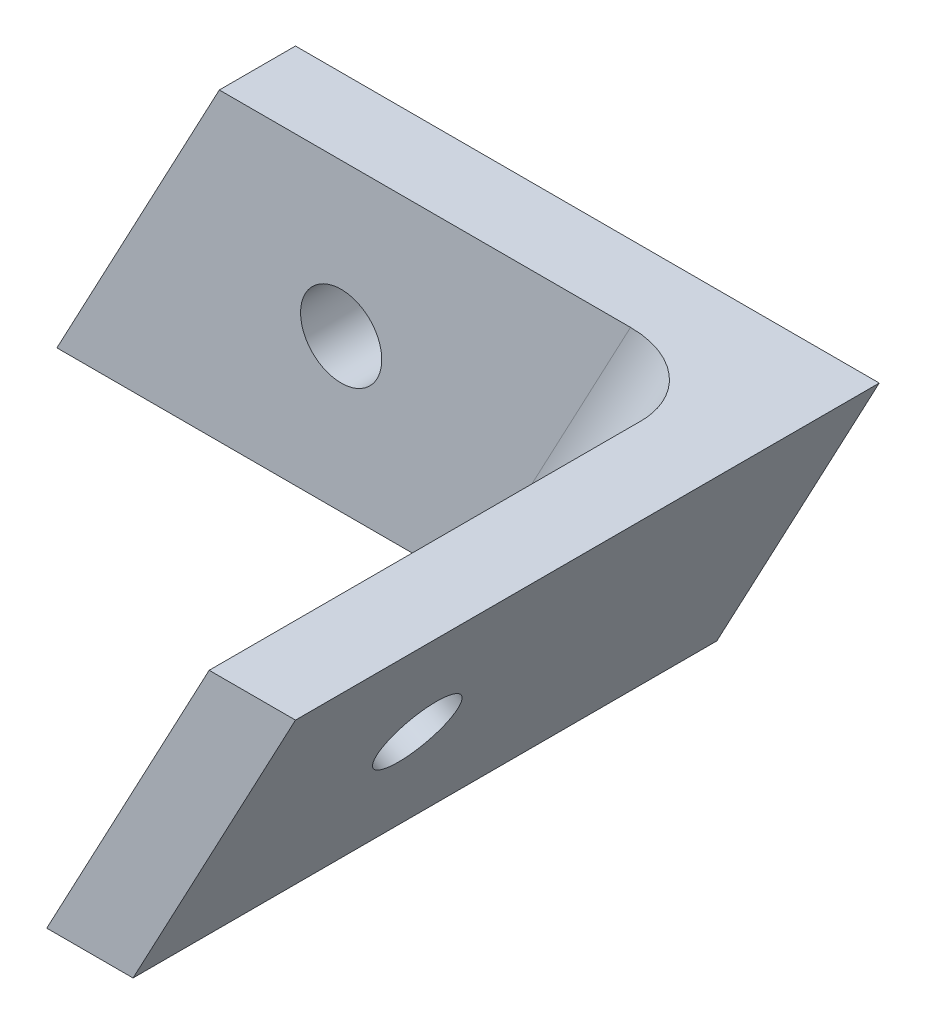
ISO-10303-21;
HEADER;
FILE_DESCRIPTION(('STEP AP214'),'2;1');
FILE_NAME('part.step','',(''),(''),'','','');
FILE_SCHEMA(('AUTOMOTIVE_DESIGN { 1 0 10303 214 1 1 1 1 }'));
ENDSEC;
DATA;
#1=APPLICATION_CONTEXT('core data for automotive mechanical design processes');
#2=APPLICATION_PROTOCOL_DEFINITION('international standard','automotive_design',2000,#1);
#3=PRODUCT_CONTEXT('',#1,'mechanical');
#4=PRODUCT('Part','Part','',(#3));
#5=PRODUCT_RELATED_PRODUCT_CATEGORY('part','',(#4));
#6=PRODUCT_DEFINITION_FORMATION('','',#4);
#7=PRODUCT_DEFINITION_CONTEXT('part definition',#1,'design');
#8=PRODUCT_DEFINITION('design','',#6,#7);
#9=PRODUCT_DEFINITION_SHAPE('','',#8);
#10=(LENGTH_UNIT() NAMED_UNIT(*) SI_UNIT(.MILLI.,.METRE.));
#11=(NAMED_UNIT(*) PLANE_ANGLE_UNIT() SI_UNIT($,.RADIAN.));
#12=(NAMED_UNIT(*) SI_UNIT($,.STERADIAN.) SOLID_ANGLE_UNIT());
#13=UNCERTAINTY_MEASURE_WITH_UNIT(LENGTH_MEASURE(1.E-05),#10,'distance_accuracy_value','');
#14=(GEOMETRIC_REPRESENTATION_CONTEXT(3) GLOBAL_UNCERTAINTY_ASSIGNED_CONTEXT((#13)) GLOBAL_UNIT_ASSIGNED_CONTEXT((#10,
#11,#12)) REPRESENTATION_CONTEXT('',''));
#15=CARTESIAN_POINT('',(0.,0.,0.));
#16=DIRECTION('',(0.,0.,1.));
#17=DIRECTION('',(1.,0.,0.));
#18=AXIS2_PLACEMENT_3D('',#15,#16,#17);
#19=CARTESIAN_POINT('',(0.,0.,3.));
#20=DIRECTION('',(0.,0.,-1.));
#21=DIRECTION('',(-1.,0.,0.));
#22=AXIS2_PLACEMENT_3D('',#19,#20,#21);
#23=PLANE('',#22);
#24=CARTESIAN_POINT('',(61.8,8.99999999999998,3.));
#25=DIRECTION('',(0.,0.,-1.));
#26=DIRECTION('',(-1.,0.,0.));
#27=AXIS2_PLACEMENT_3D('',#24,#25,#26);
#28=CIRCLE('',#27,1.6);
#29=CARTESIAN_POINT('',(60.2,8.99999999999998,3.));
#30=VERTEX_POINT('',#29);
#31=EDGE_CURVE('E271',#30,#30,#28,.T.);
#32=ORIENTED_EDGE('',*,*,#31,.T.);
#33=EDGE_LOOP('',(#32));
#34=FACE_BOUND('',#33,.T.);
#35=DIRECTION('',(1.,0.,0.));
#36=VECTOR('',#35,1.);
#37=CARTESIAN_POINT('',(73.6,3.,3.));
#38=LINE('',#37,#36);
#39=CARTESIAN_POINT('',(50.6,2.99999999999999,3.));
#40=VERTEX_POINT('',#39);
#41=CARTESIAN_POINT('',(66.8,2.99999999999999,3.));
#42=VERTEX_POINT('',#41);
#43=EDGE_CURVE('E130',#40,#42,#38,.T.);
#44=ORIENTED_EDGE('',*,*,#43,.T.);
#45=DIRECTION('',(-0.470588235294119,-0.88235294117647,0.));
#46=VECTOR('',#45,1.);
#47=CARTESIAN_POINT('',(73.9529411764706,16.4117647058823,3.));
#48=LINE('',#47,#46);
#49=CARTESIAN_POINT('',(73.2,15.,3.));
#50=VERTEX_POINT('',#49);
#51=EDGE_CURVE('E55',#42,#50,#48,.F.);
#52=ORIENTED_EDGE('',*,*,#51,.T.);
#53=DIRECTION('',(-1.,0.,0.));
#54=VECTOR('',#53,1.);
#55=CARTESIAN_POINT('',(57.,15.,3.));
#56=LINE('',#55,#54);
#57=CARTESIAN_POINT('',(57.,15.,3.));
#58=VERTEX_POINT('',#57);
#59=EDGE_CURVE('E125',#50,#58,#56,.T.);
#60=ORIENTED_EDGE('',*,*,#59,.T.);
#61=DIRECTION('',(-0.470588235294118,-0.882352941176471,0.));
#62=VECTOR('',#61,1.);
#63=CARTESIAN_POINT('',(50.6,2.99999999999999,3.));
#64=LINE('',#63,#62);
#65=EDGE_CURVE('E127',#58,#40,#64,.T.);
#66=ORIENTED_EDGE('',*,*,#65,.T.);
#67=EDGE_LOOP('',(#44,#52,#60,#66));
#68=FACE_BOUND('',#67,.T.);
#69=ADVANCED_FACE('F34',(#34,#68),#23,.F.);
#70=CARTESIAN_POINT('',(80.,15.,3.));
#71=DIRECTION('',(-0.88235294117647,0.470588235294119,0.));
#72=DIRECTION('',(-0.470588235294119,-0.88235294117647,0.));
#73=AXIS2_PLACEMENT_3D('',#70,#71,#72);
#74=PLANE('',#73);
#75=CARTESIAN_POINT('',(76.7999999999999,8.99999999999997,15.));
#76=DIRECTION('',(-0.88235294117647,0.470588235294118,0.));
#77=DIRECTION('',(-0.470588235294118,-0.88235294117647,0.));
#78=AXIS2_PLACEMENT_3D('',#75,#76,#77);
#79=CIRCLE('',#78,1.6);
#80=CARTESIAN_POINT('',(76.0470588235293,7.58823529411762,15.));
#81=VERTEX_POINT('',#80);
#82=EDGE_CURVE('E272',#81,#81,#79,.T.);
#83=ORIENTED_EDGE('',*,*,#82,.T.);
#84=EDGE_LOOP('',(#83));
#85=FACE_BOUND('',#84,.T.);
#86=DIRECTION('',(0.470588235294119,0.88235294117647,0.));
#87=VECTOR('',#86,1.);
#88=CARTESIAN_POINT('',(80.,15.,0.));
#89=LINE('',#88,#87);
#90=CARTESIAN_POINT('',(73.6,3.,0.));
#91=VERTEX_POINT('',#90);
#92=CARTESIAN_POINT('',(80.,15.,0.));
#93=VERTEX_POINT('',#92);
#94=EDGE_CURVE('E116',#91,#93,#89,.T.);
#95=ORIENTED_EDGE('',*,*,#94,.T.);
#96=DIRECTION('',(0.,0.,-1.));
#97=VECTOR('',#96,1.);
#98=CARTESIAN_POINT('',(80.,15.,3.));
#99=LINE('',#98,#97);
#100=CARTESIAN_POINT('',(80.,15.,23.));
#101=VERTEX_POINT('',#100);
#102=EDGE_CURVE('E143',#101,#93,#99,.T.);
#103=ORIENTED_EDGE('',*,*,#102,.F.);
#104=DIRECTION('',(0.470588235294119,0.88235294117647,0.));
#105=VECTOR('',#104,1.);
#106=CARTESIAN_POINT('',(80.,15.,23.));
#107=LINE('',#106,#105);
#108=CARTESIAN_POINT('',(73.6,3.,23.));
#109=VERTEX_POINT('',#108);
#110=EDGE_CURVE('E100',#109,#101,#107,.T.);
#111=ORIENTED_EDGE('',*,*,#110,.F.);
#112=DIRECTION('',(0.,0.,-1.));
#113=VECTOR('',#112,1.);
#114=CARTESIAN_POINT('',(73.6,3.,3.));
#115=LINE('',#114,#113);
#116=EDGE_CURVE('E96',#109,#91,#115,.T.);
#117=ORIENTED_EDGE('',*,*,#116,.T.);
#118=EDGE_LOOP('',(#95,#103,#111,#117));
#119=FACE_BOUND('',#118,.T.);
#120=ADVANCED_FACE('F152',(#85,#119),#74,.F.);
#121=CARTESIAN_POINT('',(57.,15.,3.));
#122=DIRECTION('',(0.,-1.,0.));
#123=DIRECTION('',(1.,0.,0.));
#124=AXIS2_PLACEMENT_3D('',#121,#122,#123);
#125=PLANE('',#124);
#126=DIRECTION('',(-1.,0.,0.));
#127=VECTOR('',#126,1.);
#128=CARTESIAN_POINT('',(57.,15.,0.));
#129=LINE('',#128,#127);
#130=CARTESIAN_POINT('',(57.,15.,0.));
#131=VERTEX_POINT('',#130);
#132=EDGE_CURVE('E120',#93,#131,#129,.T.);
#133=ORIENTED_EDGE('',*,*,#132,.T.);
#134=DIRECTION('',(0.,0.,-1.));
#135=VECTOR('',#134,1.);
#136=CARTESIAN_POINT('',(57.,15.,3.));
#137=LINE('',#136,#135);
#138=EDGE_CURVE('E140',#58,#131,#137,.T.);
#139=ORIENTED_EDGE('',*,*,#138,.F.);
#140=ORIENTED_EDGE('',*,*,#59,.F.);
#141=CARTESIAN_POINT('',(73.2,15.,6.));
#142=DIRECTION('',(0.,-1.,0.));
#143=DIRECTION('',(1.,0.,0.));
#144=AXIS2_PLACEMENT_3D('',#141,#142,#143);
#145=ELLIPSE('',#144,3.4,3.);
#146=CARTESIAN_POINT('',(76.6,15.,6.));
#147=VERTEX_POINT('',#146);
#148=EDGE_CURVE('E11',#50,#147,#145,.T.);
#149=ORIENTED_EDGE('',*,*,#148,.T.);
#150=DIRECTION('',(0.,0.,-1.));
#151=VECTOR('',#150,1.);
#152=CARTESIAN_POINT('',(76.6,15.,23.));
#153=LINE('',#152,#151);
#154=CARTESIAN_POINT('',(76.6,15.,23.));
#155=VERTEX_POINT('',#154);
#156=EDGE_CURVE('E117',#155,#147,#153,.T.);
#157=ORIENTED_EDGE('',*,*,#156,.F.);
#158=DIRECTION('',(-1.,0.,0.));
#159=VECTOR('',#158,1.);
#160=CARTESIAN_POINT('',(76.6,15.,23.));
#161=LINE('',#160,#159);
#162=EDGE_CURVE('E106',#101,#155,#161,.T.);
#163=ORIENTED_EDGE('',*,*,#162,.F.);
#164=ORIENTED_EDGE('',*,*,#102,.T.);
#165=EDGE_LOOP('',(#133,#139,#140,#149,#157,#163,#164));
#166=FACE_BOUND('',#165,.T.);
#167=ADVANCED_FACE('F148',(#166),#125,.F.);
#168=CARTESIAN_POINT('',(50.6,2.99999999999999,3.));
#169=DIRECTION('',(0.882352941176471,-0.470588235294118,0.));
#170=DIRECTION('',(0.470588235294118,0.882352941176471,0.));
#171=AXIS2_PLACEMENT_3D('',#168,#169,#170);
#172=PLANE('',#171);
#173=DIRECTION('',(-0.470588235294118,-0.882352941176471,0.));
#174=VECTOR('',#173,1.);
#175=CARTESIAN_POINT('',(50.6,2.99999999999999,0.));
#176=LINE('',#175,#174);
#177=CARTESIAN_POINT('',(50.6,2.99999999999999,0.));
#178=VERTEX_POINT('',#177);
#179=EDGE_CURVE('E133',#131,#178,#176,.T.);
#180=ORIENTED_EDGE('',*,*,#179,.T.);
#181=DIRECTION('',(0.,0.,-1.));
#182=VECTOR('',#181,1.);
#183=CARTESIAN_POINT('',(50.6,2.99999999999999,3.));
#184=LINE('',#183,#182);
#185=EDGE_CURVE('E137',#40,#178,#184,.T.);
#186=ORIENTED_EDGE('',*,*,#185,.F.);
#187=ORIENTED_EDGE('',*,*,#65,.F.);
#188=ORIENTED_EDGE('',*,*,#138,.T.);
#189=EDGE_LOOP('',(#180,#186,#187,#188));
#190=FACE_BOUND('',#189,.T.);
#191=ADVANCED_FACE('F159',(#190),#172,.F.);
#192=CARTESIAN_POINT('',(73.6,3.,3.));
#193=DIRECTION('',(0.,1.,0.));
#194=DIRECTION('',(-1.,0.,0.));
#195=AXIS2_PLACEMENT_3D('',#192,#193,#194);
#196=PLANE('',#195);
#197=DIRECTION('',(1.,0.,0.));
#198=VECTOR('',#197,1.);
#199=CARTESIAN_POINT('',(73.6,3.,0.));
#200=LINE('',#199,#198);
#201=EDGE_CURVE('E128',#178,#91,#200,.T.);
#202=ORIENTED_EDGE('',*,*,#201,.T.);
#203=ORIENTED_EDGE('',*,*,#116,.F.);
#204=DIRECTION('',(1.,0.,0.));
#205=VECTOR('',#204,1.);
#206=CARTESIAN_POINT('',(73.6,3.,23.));
#207=LINE('',#206,#205);
#208=CARTESIAN_POINT('',(70.2,2.99999999999999,23.));
#209=VERTEX_POINT('',#208);
#210=EDGE_CURVE('E90',#209,#109,#207,.T.);
#211=ORIENTED_EDGE('',*,*,#210,.F.);
#212=DIRECTION('',(0.,0.,-1.));
#213=VECTOR('',#212,1.);
#214=CARTESIAN_POINT('',(70.2,2.99999999999999,23.));
#215=LINE('',#214,#213);
#216=CARTESIAN_POINT('',(70.2,2.99999999999999,6.));
#217=VERTEX_POINT('',#216);
#218=EDGE_CURVE('E94',#209,#217,#215,.T.);
#219=ORIENTED_EDGE('',*,*,#218,.T.);
#220=CARTESIAN_POINT('',(66.8,2.99999999999999,6.));
#221=DIRECTION('',(0.,1.,0.));
#222=DIRECTION('',(1.,0.,0.));
#223=AXIS2_PLACEMENT_3D('',#220,#221,#222);
#224=ELLIPSE('',#223,3.4,3.);
#225=EDGE_CURVE('E42',#217,#42,#224,.T.);
#226=ORIENTED_EDGE('',*,*,#225,.T.);
#227=ORIENTED_EDGE('',*,*,#43,.F.);
#228=ORIENTED_EDGE('',*,*,#185,.T.);
#229=EDGE_LOOP('',(#202,#203,#211,#219,#226,#227,#228));
#230=FACE_BOUND('',#229,.T.);
#231=ADVANCED_FACE('F92',(#230),#196,.F.);
#232=CARTESIAN_POINT('',(0.,0.,0.));
#233=DIRECTION('',(0.,0.,-1.));
#234=DIRECTION('',(-1.,0.,0.));
#235=AXIS2_PLACEMENT_3D('',#232,#233,#234);
#236=PLANE('',#235);
#237=CARTESIAN_POINT('',(61.8,8.99999999999998,0.));
#238=DIRECTION('',(0.,0.,1.));
#239=DIRECTION('',(1.,0.,0.));
#240=AXIS2_PLACEMENT_3D('',#237,#238,#239);
#241=CIRCLE('',#240,1.6);
#242=CARTESIAN_POINT('',(63.4,8.99999999999998,0.));
#243=VERTEX_POINT('',#242);
#244=EDGE_CURVE('E110',#243,#243,#241,.T.);
#245=ORIENTED_EDGE('',*,*,#244,.T.);
#246=EDGE_LOOP('',(#245));
#247=FACE_BOUND('',#246,.T.);
#248=ORIENTED_EDGE('',*,*,#94,.F.);
#249=ORIENTED_EDGE('',*,*,#201,.F.);
#250=ORIENTED_EDGE('',*,*,#179,.F.);
#251=ORIENTED_EDGE('',*,*,#132,.F.);
#252=EDGE_LOOP('',(#248,#249,#250,#251));
#253=FACE_BOUND('',#252,.T.);
#254=ADVANCED_FACE('F155',(#247,#253),#236,.T.);
#255=CARTESIAN_POINT('',(70.2,2.99999999999999,23.));
#256=DIRECTION('',(0.88235294117647,-0.470588235294119,0.));
#257=DIRECTION('',(0.470588235294119,0.88235294117647,0.));
#258=AXIS2_PLACEMENT_3D('',#255,#256,#257);
#259=PLANE('',#258);
#260=CARTESIAN_POINT('',(74.1529411764706,10.4117647058823,15.));
#261=DIRECTION('',(0.88235294117647,-0.470588235294119,0.));
#262=DIRECTION('',(0.470588235294119,0.88235294117647,0.));
#263=AXIS2_PLACEMENT_3D('',#260,#261,#262);
#264=CIRCLE('',#263,1.6);
#265=CARTESIAN_POINT('',(74.9058823529411,11.8235294117646,15.));
#266=VERTEX_POINT('',#265);
#267=EDGE_CURVE('E276',#266,#266,#264,.T.);
#268=ORIENTED_EDGE('',*,*,#267,.T.);
#269=EDGE_LOOP('',(#268));
#270=FACE_BOUND('',#269,.T.);
#271=ORIENTED_EDGE('',*,*,#156,.T.);
#272=DIRECTION('',(-0.470588235294119,-0.88235294117647,0.));
#273=VECTOR('',#272,1.);
#274=CARTESIAN_POINT('',(70.2,2.99999999999999,6.));
#275=LINE('',#274,#273);
#276=EDGE_CURVE('E115',#147,#217,#275,.T.);
#277=ORIENTED_EDGE('',*,*,#276,.T.);
#278=ORIENTED_EDGE('',*,*,#218,.F.);
#279=DIRECTION('',(-0.470588235294119,-0.88235294117647,0.));
#280=VECTOR('',#279,1.);
#281=CARTESIAN_POINT('',(70.2,2.99999999999999,23.));
#282=LINE('',#281,#280);
#283=EDGE_CURVE('E101',#155,#209,#282,.T.);
#284=ORIENTED_EDGE('',*,*,#283,.F.);
#285=EDGE_LOOP('',(#271,#277,#278,#284));
#286=FACE_BOUND('',#285,.T.);
#287=ADVANCED_FACE('F113',(#270,#286),#259,.F.);
#288=CARTESIAN_POINT('',(0.,0.,23.));
#289=DIRECTION('',(0.,0.,-1.));
#290=DIRECTION('',(-1.,0.,0.));
#291=AXIS2_PLACEMENT_3D('',#288,#289,#290);
#292=PLANE('',#291);
#293=ORIENTED_EDGE('',*,*,#283,.T.);
#294=ORIENTED_EDGE('',*,*,#210,.T.);
#295=ORIENTED_EDGE('',*,*,#110,.T.);
#296=ORIENTED_EDGE('',*,*,#162,.T.);
#297=EDGE_LOOP('',(#293,#294,#295,#296));
#298=FACE_BOUND('',#297,.T.);
#299=ADVANCED_FACE('F104',(#298),#292,.F.);
#300=CARTESIAN_POINT('',(61.8,8.99999999999998,23.001));
#301=DIRECTION('',(0.,0.,-1.));
#302=DIRECTION('',(-1.,0.,0.));
#303=AXIS2_PLACEMENT_3D('',#300,#301,#302);
#304=CYLINDRICAL_SURFACE('',#303,1.6);
#305=ORIENTED_EDGE('',*,*,#244,.F.);
#306=EDGE_LOOP('',(#305));
#307=FACE_BOUND('',#306,.T.);
#308=ORIENTED_EDGE('',*,*,#31,.F.);
#309=EDGE_LOOP('',(#308));
#310=FACE_BOUND('',#309,.T.);
#311=ADVANCED_FACE('F168',(#307,#310),#304,.F.);
#312=CARTESIAN_POINT('',(53.9095328719723,21.2082491349481,15.));
#313=DIRECTION('',(0.88235294117647,-0.470588235294118,0.));
#314=DIRECTION('',(0.470588235294118,0.88235294117647,0.));
#315=AXIS2_PLACEMENT_3D('',#312,#313,#314);
#316=CYLINDRICAL_SURFACE('',#315,1.6);
#317=ORIENTED_EDGE('',*,*,#82,.F.);
#318=EDGE_LOOP('',(#317));
#319=FACE_BOUND('',#318,.T.);
#320=ORIENTED_EDGE('',*,*,#267,.F.);
#321=EDGE_LOOP('',(#320));
#322=FACE_BOUND('',#321,.T.);
#323=ADVANCED_FACE('F164',(#319,#322),#316,.F.);
#324=CARTESIAN_POINT('',(67.5529411764706,4.41176470588235,6.));
#325=DIRECTION('',(0.470588235294119,0.88235294117647,0.));
#326=DIRECTION('',(-0.88235294117647,0.470588235294119,0.));
#327=AXIS2_PLACEMENT_3D('',#324,#325,#326);
#328=CYLINDRICAL_SURFACE('',#327,3.);
#329=ORIENTED_EDGE('',*,*,#148,.F.);
#330=ORIENTED_EDGE('',*,*,#51,.F.);
#331=ORIENTED_EDGE('',*,*,#225,.F.);
#332=ORIENTED_EDGE('',*,*,#276,.F.);
#333=EDGE_LOOP('',(#329,#330,#331,#332));
#334=FACE_BOUND('',#333,.T.);
#335=ADVANCED_FACE('F36',(#334),#328,.F.);
#336=CLOSED_SHELL('',(#69,#120,#167,#191,#231,#254,#287,#299,#311,#323,#335));
#337=MANIFOLD_SOLID_BREP('B2',#336);
#338=ADVANCED_BREP_SHAPE_REPRESENTATION('',(#18,#337),#14);
#339=SHAPE_DEFINITION_REPRESENTATION(#9,#338);
ENDSEC;
END-ISO-10303-21;
